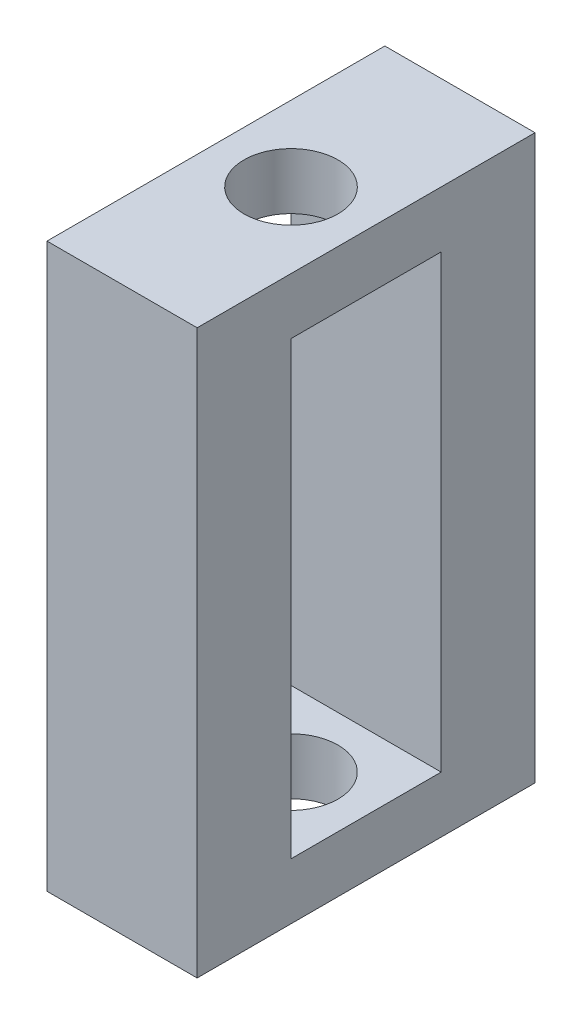
ISO-10303-21;
HEADER;
FILE_DESCRIPTION(('STEP AP214'),'2;1');
FILE_NAME('part.step','',(''),(''),'','','');
FILE_SCHEMA(('AUTOMOTIVE_DESIGN { 1 0 10303 214 1 1 1 1 }'));
ENDSEC;
DATA;
#1=APPLICATION_CONTEXT('core data for automotive mechanical design processes');
#2=APPLICATION_PROTOCOL_DEFINITION('international standard','automotive_design',2000,#1);
#3=PRODUCT_CONTEXT('',#1,'mechanical');
#4=PRODUCT('Part','Part','',(#3));
#5=PRODUCT_RELATED_PRODUCT_CATEGORY('part','',(#4));
#6=PRODUCT_DEFINITION_FORMATION('','',#4);
#7=PRODUCT_DEFINITION_CONTEXT('part definition',#1,'design');
#8=PRODUCT_DEFINITION('design','',#6,#7);
#9=PRODUCT_DEFINITION_SHAPE('','',#8);
#10=(LENGTH_UNIT() NAMED_UNIT(*) SI_UNIT(.MILLI.,.METRE.));
#11=(NAMED_UNIT(*) PLANE_ANGLE_UNIT() SI_UNIT($,.RADIAN.));
#12=(NAMED_UNIT(*) SI_UNIT($,.STERADIAN.) SOLID_ANGLE_UNIT());
#13=UNCERTAINTY_MEASURE_WITH_UNIT(LENGTH_MEASURE(1.E-05),#10,'distance_accuracy_value','');
#14=(GEOMETRIC_REPRESENTATION_CONTEXT(3) GLOBAL_UNCERTAINTY_ASSIGNED_CONTEXT((#13)) GLOBAL_UNIT_ASSIGNED_CONTEXT((#10,
#11,#12)) REPRESENTATION_CONTEXT('',''));
#15=CARTESIAN_POINT('',(0.,0.,0.));
#16=DIRECTION('',(0.,0.,1.));
#17=DIRECTION('',(1.,0.,0.));
#18=AXIS2_PLACEMENT_3D('',#15,#16,#17);
#19=CARTESIAN_POINT('',(4.,0.,-9.));
#20=DIRECTION('',(0.,1.,0.));
#21=DIRECTION('',(0.,0.,1.));
#22=AXIS2_PLACEMENT_3D('',#19,#20,#21);
#23=CYLINDRICAL_SURFACE('',#22,2.5);
#24=CARTESIAN_POINT('',(4.,27.,-9.));
#25=DIRECTION('',(0.,1.,0.));
#26=DIRECTION('',(0.,0.,1.));
#27=AXIS2_PLACEMENT_3D('',#24,#25,#26);
#28=CIRCLE('',#27,2.5);
#29=CARTESIAN_POINT('',(4.,27.,-6.5));
#30=VERTEX_POINT('',#29);
#31=EDGE_CURVE('E143',#30,#30,#28,.F.);
#32=ORIENTED_EDGE('',*,*,#31,.T.);
#33=EDGE_LOOP('',(#32));
#34=FACE_BOUND('',#33,.T.);
#35=CARTESIAN_POINT('',(4.,30.,-9.));
#36=DIRECTION('',(0.,1.,0.));
#37=DIRECTION('',(0.,0.,1.));
#38=AXIS2_PLACEMENT_3D('',#35,#36,#37);
#39=CIRCLE('',#38,2.5);
#40=CARTESIAN_POINT('',(4.,30.,-6.5));
#41=VERTEX_POINT('',#40);
#42=EDGE_CURVE('E147',#41,#41,#39,.T.);
#43=ORIENTED_EDGE('',*,*,#42,.T.);
#44=EDGE_LOOP('',(#43));
#45=FACE_BOUND('',#44,.T.);
#46=ADVANCED_FACE('F39',(#34,#45),#23,.F.);
#47=CARTESIAN_POINT('',(0.,30.,0.));
#48=DIRECTION('',(0.,0.,-1.));
#49=DIRECTION('',(-1.,0.,0.));
#50=AXIS2_PLACEMENT_3D('',#47,#48,#49);
#51=PLANE('',#50);
#52=DIRECTION('',(1.,0.,0.));
#53=VECTOR('',#52,1.);
#54=CARTESIAN_POINT('',(0.,0.,0.));
#55=LINE('',#54,#53);
#56=CARTESIAN_POINT('',(0.,0.,0.));
#57=VERTEX_POINT('',#56);
#58=CARTESIAN_POINT('',(8.,0.,0.));
#59=VERTEX_POINT('',#58);
#60=EDGE_CURVE('E152',#57,#59,#55,.T.);
#61=ORIENTED_EDGE('',*,*,#60,.T.);
#62=DIRECTION('',(0.,-1.,0.));
#63=VECTOR('',#62,1.);
#64=CARTESIAN_POINT('',(8.,30.,0.));
#65=LINE('',#64,#63);
#66=CARTESIAN_POINT('',(8.,30.,0.));
#67=VERTEX_POINT('',#66);
#68=EDGE_CURVE('E195',#67,#59,#65,.T.);
#69=ORIENTED_EDGE('',*,*,#68,.F.);
#70=DIRECTION('',(1.,0.,0.));
#71=VECTOR('',#70,1.);
#72=CARTESIAN_POINT('',(0.,30.,0.));
#73=LINE('',#72,#71);
#74=CARTESIAN_POINT('',(0.,30.,0.));
#75=VERTEX_POINT('',#74);
#76=EDGE_CURVE('E156',#75,#67,#73,.T.);
#77=ORIENTED_EDGE('',*,*,#76,.F.);
#78=DIRECTION('',(0.,-1.,0.));
#79=VECTOR('',#78,1.);
#80=CARTESIAN_POINT('',(0.,30.,0.));
#81=LINE('',#80,#79);
#82=EDGE_CURVE('E172',#75,#57,#81,.T.);
#83=ORIENTED_EDGE('',*,*,#82,.T.);
#84=EDGE_LOOP('',(#61,#69,#77,#83));
#85=FACE_BOUND('',#84,.T.);
#86=ADVANCED_FACE('F41',(#85),#51,.F.);
#87=CARTESIAN_POINT('',(8.,30.,0.));
#88=DIRECTION('',(-1.,0.,0.));
#89=DIRECTION('',(0.,0.,1.));
#90=AXIS2_PLACEMENT_3D('',#87,#88,#89);
#91=PLANE('',#90);
#92=DIRECTION('',(0.,0.,-1.));
#93=VECTOR('',#92,1.);
#94=CARTESIAN_POINT('',(8.,3.,-5.));
#95=LINE('',#94,#93);
#96=CARTESIAN_POINT('',(8.,3.,-5.));
#97=VERTEX_POINT('',#96);
#98=CARTESIAN_POINT('',(8.,3.,-13.));
#99=VERTEX_POINT('',#98);
#100=EDGE_CURVE('E116',#97,#99,#95,.T.);
#101=ORIENTED_EDGE('',*,*,#100,.F.);
#102=DIRECTION('',(0.,-1.,0.));
#103=VECTOR('',#102,1.);
#104=CARTESIAN_POINT('',(8.,27.,-5.));
#105=LINE('',#104,#103);
#106=CARTESIAN_POINT('',(8.,27.,-5.));
#107=VERTEX_POINT('',#106);
#108=EDGE_CURVE('E55',#107,#97,#105,.T.);
#109=ORIENTED_EDGE('',*,*,#108,.F.);
#110=DIRECTION('',(0.,0.,1.));
#111=VECTOR('',#110,1.);
#112=CARTESIAN_POINT('',(8.,27.,-5.));
#113=LINE('',#112,#111);
#114=CARTESIAN_POINT('',(8.,27.,-13.));
#115=VERTEX_POINT('',#114);
#116=EDGE_CURVE('E125',#115,#107,#113,.T.);
#117=ORIENTED_EDGE('',*,*,#116,.F.);
#118=DIRECTION('',(0.,1.,0.));
#119=VECTOR('',#118,1.);
#120=CARTESIAN_POINT('',(8.,27.,-13.));
#121=LINE('',#120,#119);
#122=EDGE_CURVE('E107',#99,#115,#121,.T.);
#123=ORIENTED_EDGE('',*,*,#122,.F.);
#124=EDGE_LOOP('',(#101,#109,#117,#123));
#125=FACE_BOUND('',#124,.T.);
#126=DIRECTION('',(0.,0.,-1.));
#127=VECTOR('',#126,1.);
#128=CARTESIAN_POINT('',(8.,0.,0.));
#129=LINE('',#128,#127);
#130=CARTESIAN_POINT('',(8.,0.,-18.));
#131=VERTEX_POINT('',#130);
#132=EDGE_CURVE('E176',#59,#131,#129,.T.);
#133=ORIENTED_EDGE('',*,*,#132,.T.);
#134=DIRECTION('',(0.,-1.,0.));
#135=VECTOR('',#134,1.);
#136=CARTESIAN_POINT('',(8.,30.,-18.));
#137=LINE('',#136,#135);
#138=CARTESIAN_POINT('',(8.,30.,-18.));
#139=VERTEX_POINT('',#138);
#140=EDGE_CURVE('E192',#139,#131,#137,.T.);
#141=ORIENTED_EDGE('',*,*,#140,.F.);
#142=DIRECTION('',(0.,0.,-1.));
#143=VECTOR('',#142,1.);
#144=CARTESIAN_POINT('',(8.,30.,0.));
#145=LINE('',#144,#143);
#146=EDGE_CURVE('E160',#67,#139,#145,.T.);
#147=ORIENTED_EDGE('',*,*,#146,.F.);
#148=ORIENTED_EDGE('',*,*,#68,.T.);
#149=EDGE_LOOP('',(#133,#141,#147,#148));
#150=FACE_BOUND('',#149,.T.);
#151=ADVANCED_FACE('F122',(#125,#150),#91,.F.);
#152=CARTESIAN_POINT('',(0.,30.,-18.));
#153=DIRECTION('',(0.,0.,-1.));
#154=DIRECTION('',(-1.,0.,0.));
#155=AXIS2_PLACEMENT_3D('',#152,#153,#154);
#156=PLANE('',#155);
#157=DIRECTION('',(1.,0.,0.));
#158=VECTOR('',#157,1.);
#159=CARTESIAN_POINT('',(0.,0.,-18.));
#160=LINE('',#159,#158);
#161=CARTESIAN_POINT('',(0.,0.,-18.));
#162=VERTEX_POINT('',#161);
#163=EDGE_CURVE('E180',#162,#131,#160,.T.);
#164=ORIENTED_EDGE('',*,*,#163,.F.);
#165=DIRECTION('',(0.,-1.,0.));
#166=VECTOR('',#165,1.);
#167=CARTESIAN_POINT('',(0.,30.,-18.));
#168=LINE('',#167,#166);
#169=CARTESIAN_POINT('',(0.,30.,-18.));
#170=VERTEX_POINT('',#169);
#171=EDGE_CURVE('E189',#170,#162,#168,.T.);
#172=ORIENTED_EDGE('',*,*,#171,.F.);
#173=DIRECTION('',(1.,0.,0.));
#174=VECTOR('',#173,1.);
#175=CARTESIAN_POINT('',(0.,30.,-18.));
#176=LINE('',#175,#174);
#177=EDGE_CURVE('E164',#170,#139,#176,.T.);
#178=ORIENTED_EDGE('',*,*,#177,.T.);
#179=ORIENTED_EDGE('',*,*,#140,.T.);
#180=EDGE_LOOP('',(#164,#172,#178,#179));
#181=FACE_BOUND('',#180,.T.);
#182=ADVANCED_FACE('F241',(#181),#156,.T.);
#183=CARTESIAN_POINT('',(0.,30.,0.));
#184=DIRECTION('',(-1.,0.,0.));
#185=DIRECTION('',(0.,0.,1.));
#186=AXIS2_PLACEMENT_3D('',#183,#184,#185);
#187=PLANE('',#186);
#188=DIRECTION('',(0.,1.,0.));
#189=VECTOR('',#188,1.);
#190=CARTESIAN_POINT('',(0.,30.,-5.));
#191=LINE('',#190,#189);
#192=CARTESIAN_POINT('',(0.,3.,-5.));
#193=VERTEX_POINT('',#192);
#194=CARTESIAN_POINT('',(0.,27.,-5.));
#195=VERTEX_POINT('',#194);
#196=EDGE_CURVE('E11',#193,#195,#191,.T.);
#197=ORIENTED_EDGE('',*,*,#196,.F.);
#198=DIRECTION('',(0.,0.,1.));
#199=VECTOR('',#198,1.);
#200=CARTESIAN_POINT('',(0.,3.,0.));
#201=LINE('',#200,#199);
#202=CARTESIAN_POINT('',(0.,3.,-13.));
#203=VERTEX_POINT('',#202);
#204=EDGE_CURVE('E140',#203,#193,#201,.T.);
#205=ORIENTED_EDGE('',*,*,#204,.F.);
#206=DIRECTION('',(0.,-1.,0.));
#207=VECTOR('',#206,1.);
#208=CARTESIAN_POINT('',(0.,30.,-13.));
#209=LINE('',#208,#207);
#210=CARTESIAN_POINT('',(0.,27.,-13.));
#211=VERTEX_POINT('',#210);
#212=EDGE_CURVE('E48',#211,#203,#209,.T.);
#213=ORIENTED_EDGE('',*,*,#212,.F.);
#214=DIRECTION('',(0.,0.,-1.));
#215=VECTOR('',#214,1.);
#216=CARTESIAN_POINT('',(0.,27.,0.));
#217=LINE('',#216,#215);
#218=EDGE_CURVE('E144',#195,#211,#217,.T.);
#219=ORIENTED_EDGE('',*,*,#218,.F.);
#220=EDGE_LOOP('',(#197,#205,#213,#219));
#221=FACE_BOUND('',#220,.T.);
#222=DIRECTION('',(0.,0.,-1.));
#223=VECTOR('',#222,1.);
#224=CARTESIAN_POINT('',(0.,0.,0.));
#225=LINE('',#224,#223);
#226=EDGE_CURVE('E161',#57,#162,#225,.T.);
#227=ORIENTED_EDGE('',*,*,#226,.F.);
#228=ORIENTED_EDGE('',*,*,#82,.F.);
#229=DIRECTION('',(0.,0.,-1.));
#230=VECTOR('',#229,1.);
#231=CARTESIAN_POINT('',(0.,30.,0.));
#232=LINE('',#231,#230);
#233=EDGE_CURVE('E168',#75,#170,#232,.T.);
#234=ORIENTED_EDGE('',*,*,#233,.T.);
#235=ORIENTED_EDGE('',*,*,#171,.T.);
#236=EDGE_LOOP('',(#227,#228,#234,#235));
#237=FACE_BOUND('',#236,.T.);
#238=ADVANCED_FACE('F234',(#221,#237),#187,.T.);
#239=CARTESIAN_POINT('',(0.,30.,0.));
#240=DIRECTION('',(0.,1.,0.));
#241=DIRECTION('',(0.,0.,1.));
#242=AXIS2_PLACEMENT_3D('',#239,#240,#241);
#243=PLANE('',#242);
#244=ORIENTED_EDGE('',*,*,#42,.F.);
#245=EDGE_LOOP('',(#244));
#246=FACE_BOUND('',#245,.T.);
#247=ORIENTED_EDGE('',*,*,#76,.T.);
#248=ORIENTED_EDGE('',*,*,#146,.T.);
#249=ORIENTED_EDGE('',*,*,#177,.F.);
#250=ORIENTED_EDGE('',*,*,#233,.F.);
#251=EDGE_LOOP('',(#247,#248,#249,#250));
#252=FACE_BOUND('',#251,.T.);
#253=ADVANCED_FACE('F231',(#246,#252),#243,.T.);
#254=CARTESIAN_POINT('',(0.,0.,0.));
#255=DIRECTION('',(0.,1.,0.));
#256=DIRECTION('',(0.,0.,1.));
#257=AXIS2_PLACEMENT_3D('',#254,#255,#256);
#258=PLANE('',#257);
#259=CARTESIAN_POINT('',(4.,0.,-9.));
#260=DIRECTION('',(0.,1.,0.));
#261=DIRECTION('',(0.,0.,1.));
#262=AXIS2_PLACEMENT_3D('',#259,#260,#261);
#263=CIRCLE('',#262,2.5);
#264=CARTESIAN_POINT('',(4.,0.,-6.5));
#265=VERTEX_POINT('',#264);
#266=EDGE_CURVE('E148',#265,#265,#263,.T.);
#267=ORIENTED_EDGE('',*,*,#266,.T.);
#268=EDGE_LOOP('',(#267));
#269=FACE_BOUND('',#268,.T.);
#270=ORIENTED_EDGE('',*,*,#60,.F.);
#271=ORIENTED_EDGE('',*,*,#226,.T.);
#272=ORIENTED_EDGE('',*,*,#163,.T.);
#273=ORIENTED_EDGE('',*,*,#132,.F.);
#274=EDGE_LOOP('',(#270,#271,#272,#273));
#275=FACE_BOUND('',#274,.T.);
#276=ADVANCED_FACE('F220',(#269,#275),#258,.F.);
#277=CARTESIAN_POINT('',(4.,3.,-9.));
#278=DIRECTION('',(0.,-1.,0.));
#279=DIRECTION('',(0.,0.,-1.));
#280=AXIS2_PLACEMENT_3D('',#277,#278,#279);
#281=CIRCLE('',#280,2.5);
#282=CARTESIAN_POINT('',(4.,3.,-11.5));
#283=VERTEX_POINT('',#282);
#284=EDGE_CURVE('E135',#283,#283,#281,.F.);
#285=ORIENTED_EDGE('',*,*,#284,.T.);
#286=EDGE_LOOP('',(#285));
#287=FACE_BOUND('',#286,.T.);
#288=ORIENTED_EDGE('',*,*,#266,.F.);
#289=EDGE_LOOP('',(#288));
#290=FACE_BOUND('',#289,.T.);
#291=ADVANCED_FACE('F211',(#287,#290),#23,.F.);
#292=CARTESIAN_POINT('',(-22.,27.,-5.));
#293=DIRECTION('',(0.,1.,0.));
#294=DIRECTION('',(0.,0.,1.));
#295=AXIS2_PLACEMENT_3D('',#292,#293,#294);
#296=PLANE('',#295);
#297=ORIENTED_EDGE('',*,*,#218,.T.);
#298=DIRECTION('',(1.,0.,0.));
#299=VECTOR('',#298,1.);
#300=CARTESIAN_POINT('',(-22.,27.,-13.));
#301=LINE('',#300,#299);
#302=EDGE_CURVE('E112',#211,#115,#301,.T.);
#303=ORIENTED_EDGE('',*,*,#302,.T.);
#304=ORIENTED_EDGE('',*,*,#116,.T.);
#305=DIRECTION('',(1.,0.,0.));
#306=VECTOR('',#305,1.);
#307=CARTESIAN_POINT('',(-22.,27.,-5.));
#308=LINE('',#307,#306);
#309=EDGE_CURVE('E132',#195,#107,#308,.T.);
#310=ORIENTED_EDGE('',*,*,#309,.F.);
#311=EDGE_LOOP('',(#297,#303,#304,#310));
#312=FACE_BOUND('',#311,.T.);
#313=ORIENTED_EDGE('',*,*,#31,.F.);
#314=EDGE_LOOP('',(#313));
#315=FACE_BOUND('',#314,.T.);
#316=ADVANCED_FACE('F209',(#312,#315),#296,.F.);
#317=CARTESIAN_POINT('',(-22.,3.,-5.));
#318=DIRECTION('',(0.,-1.,0.));
#319=DIRECTION('',(0.,0.,-1.));
#320=AXIS2_PLACEMENT_3D('',#317,#318,#319);
#321=PLANE('',#320);
#322=ORIENTED_EDGE('',*,*,#204,.T.);
#323=DIRECTION('',(1.,0.,0.));
#324=VECTOR('',#323,1.);
#325=CARTESIAN_POINT('',(-22.,3.,-5.));
#326=LINE('',#325,#324);
#327=EDGE_CURVE('E113',#193,#97,#326,.T.);
#328=ORIENTED_EDGE('',*,*,#327,.T.);
#329=ORIENTED_EDGE('',*,*,#100,.T.);
#330=DIRECTION('',(1.,0.,0.));
#331=VECTOR('',#330,1.);
#332=CARTESIAN_POINT('',(-22.,3.,-13.));
#333=LINE('',#332,#331);
#334=EDGE_CURVE('E63',#203,#99,#333,.T.);
#335=ORIENTED_EDGE('',*,*,#334,.F.);
#336=EDGE_LOOP('',(#322,#328,#329,#335));
#337=FACE_BOUND('',#336,.T.);
#338=ORIENTED_EDGE('',*,*,#284,.F.);
#339=EDGE_LOOP('',(#338));
#340=FACE_BOUND('',#339,.T.);
#341=ADVANCED_FACE('F117',(#337,#340),#321,.F.);
#342=CARTESIAN_POINT('',(-22.,27.,-5.));
#343=DIRECTION('',(0.,0.,1.));
#344=DIRECTION('',(0.,-1.,0.));
#345=AXIS2_PLACEMENT_3D('',#342,#343,#344);
#346=PLANE('',#345);
#347=ORIENTED_EDGE('',*,*,#196,.T.);
#348=ORIENTED_EDGE('',*,*,#309,.T.);
#349=ORIENTED_EDGE('',*,*,#108,.T.);
#350=ORIENTED_EDGE('',*,*,#327,.F.);
#351=EDGE_LOOP('',(#347,#348,#349,#350));
#352=FACE_BOUND('',#351,.T.);
#353=ADVANCED_FACE('F218',(#352),#346,.F.);
#354=CARTESIAN_POINT('',(-22.,27.,-13.));
#355=DIRECTION('',(0.,0.,-1.));
#356=DIRECTION('',(0.,1.,0.));
#357=AXIS2_PLACEMENT_3D('',#354,#355,#356);
#358=PLANE('',#357);
#359=ORIENTED_EDGE('',*,*,#212,.T.);
#360=ORIENTED_EDGE('',*,*,#334,.T.);
#361=ORIENTED_EDGE('',*,*,#122,.T.);
#362=ORIENTED_EDGE('',*,*,#302,.F.);
#363=EDGE_LOOP('',(#359,#360,#361,#362));
#364=FACE_BOUND('',#363,.T.);
#365=ADVANCED_FACE('F104',(#364),#358,.F.);
#366=CLOSED_SHELL('',(#46,#86,#151,#182,#238,#253,#276,#291,#316,#341,#353,#365));
#367=MANIFOLD_SOLID_BREP('B2',#366);
#368=ADVANCED_BREP_SHAPE_REPRESENTATION('',(#18,#367),#14);
#369=SHAPE_DEFINITION_REPRESENTATION(#9,#368);
ENDSEC;
END-ISO-10303-21;
